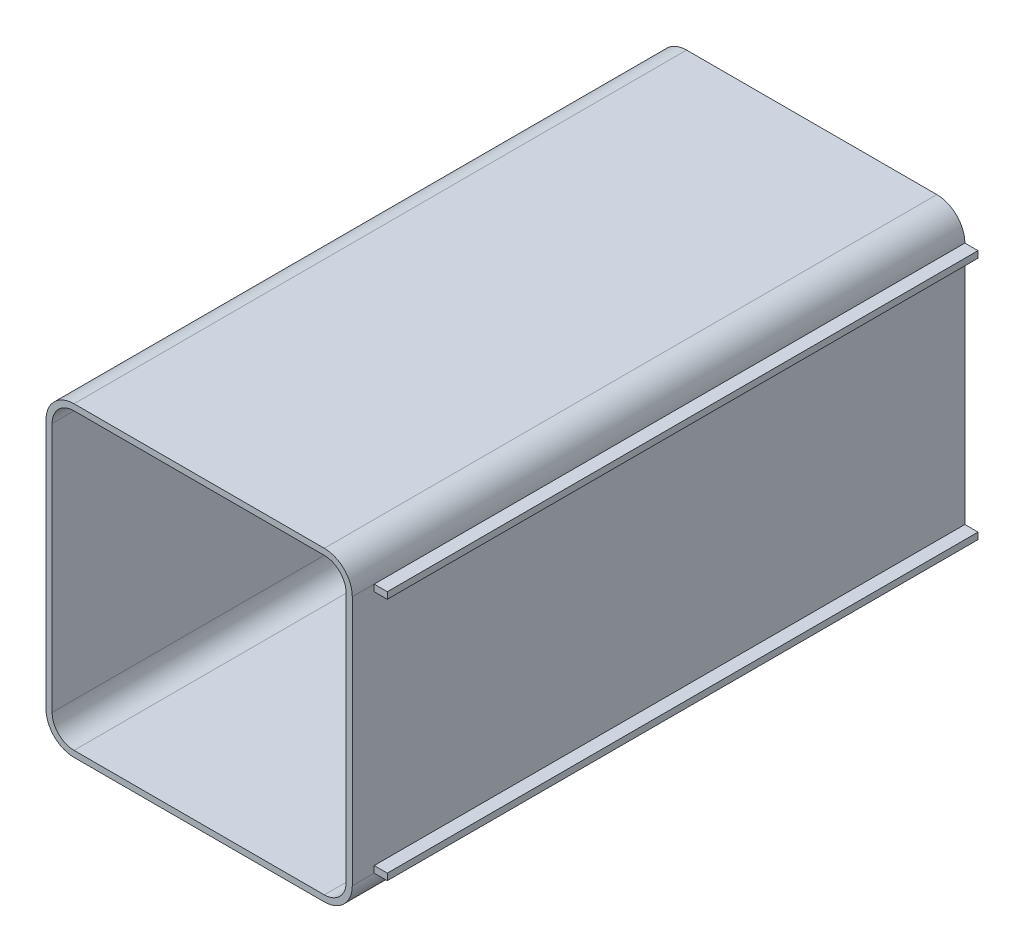
ISO-10303-21;
HEADER;
FILE_DESCRIPTION(('STEP AP214'),'2;1');
FILE_NAME('part.step','',(''),(''),'','','');
FILE_SCHEMA(('AUTOMOTIVE_DESIGN { 1 0 10303 214 1 1 1 1 }'));
ENDSEC;
DATA;
#1=APPLICATION_CONTEXT('core data for automotive mechanical design processes');
#2=APPLICATION_PROTOCOL_DEFINITION('international standard','automotive_design',2000,#1);
#3=PRODUCT_CONTEXT('',#1,'mechanical');
#4=PRODUCT('Part','Part','',(#3));
#5=PRODUCT_RELATED_PRODUCT_CATEGORY('part','',(#4));
#6=PRODUCT_DEFINITION_FORMATION('','',#4);
#7=PRODUCT_DEFINITION_CONTEXT('part definition',#1,'design');
#8=PRODUCT_DEFINITION('design','',#6,#7);
#9=PRODUCT_DEFINITION_SHAPE('','',#8);
#10=(LENGTH_UNIT() NAMED_UNIT(*) SI_UNIT(.MILLI.,.METRE.));
#11=(NAMED_UNIT(*) PLANE_ANGLE_UNIT() SI_UNIT($,.RADIAN.));
#12=(NAMED_UNIT(*) SI_UNIT($,.STERADIAN.) SOLID_ANGLE_UNIT());
#13=UNCERTAINTY_MEASURE_WITH_UNIT(LENGTH_MEASURE(1.E-05),#10,'distance_accuracy_value','');
#14=(GEOMETRIC_REPRESENTATION_CONTEXT(3) GLOBAL_UNCERTAINTY_ASSIGNED_CONTEXT((#13)) GLOBAL_UNIT_ASSIGNED_CONTEXT((#10,
#11,#12)) REPRESENTATION_CONTEXT('',''));
#15=CARTESIAN_POINT('',(0.,0.,0.));
#16=DIRECTION('',(0.,0.,1.));
#17=DIRECTION('',(1.,0.,0.));
#18=AXIS2_PLACEMENT_3D('',#15,#16,#17);
#19=CARTESIAN_POINT('',(70.,0.,140.));
#20=DIRECTION('',(-1.,0.,0.));
#21=DIRECTION('',(0.,0.,1.));
#22=AXIS2_PLACEMENT_3D('',#19,#20,#21);
#23=PLANE('',#22);
#24=DIRECTION('',(0.,-1.,0.));
#25=VECTOR('',#24,1.);
#26=CARTESIAN_POINT('',(70.,63.6,135.));
#27=LINE('',#26,#25);
#28=CARTESIAN_POINT('',(70.,63.6,135.));
#29=VERTEX_POINT('',#28);
#30=CARTESIAN_POINT('',(70.,62.1,135.));
#31=VERTEX_POINT('',#30);
#32=EDGE_CURVE('E403',#29,#31,#27,.T.);
#33=ORIENTED_EDGE('',*,*,#32,.F.);
#34=DIRECTION('',(0.,0.,-1.));
#35=VECTOR('',#34,1.);
#36=CARTESIAN_POINT('',(70.,63.6,140.));
#37=LINE('',#36,#35);
#38=CARTESIAN_POINT('',(70.,63.6,140.));
#39=VERTEX_POINT('',#38);
#40=EDGE_CURVE('E343',#29,#39,#37,.F.);
#41=ORIENTED_EDGE('',*,*,#40,.T.);
#42=DIRECTION('',(0.,1.,0.));
#43=VECTOR('',#42,1.);
#44=CARTESIAN_POINT('',(70.,0.,140.));
#45=LINE('',#44,#43);
#46=CARTESIAN_POINT('',(70.,6.4,140.));
#47=VERTEX_POINT('',#46);
#48=EDGE_CURVE('E278',#47,#39,#45,.T.);
#49=ORIENTED_EDGE('',*,*,#48,.F.);
#50=DIRECTION('',(0.,0.,-1.));
#51=VECTOR('',#50,1.);
#52=CARTESIAN_POINT('',(70.,6.4,140.));
#53=LINE('',#52,#51);
#54=CARTESIAN_POINT('',(70.,6.4,135.));
#55=VERTEX_POINT('',#54);
#56=EDGE_CURVE('E340',#47,#55,#53,.T.);
#57=ORIENTED_EDGE('',*,*,#56,.T.);
#58=DIRECTION('',(0.,-1.,0.));
#59=VECTOR('',#58,1.);
#60=CARTESIAN_POINT('',(70.,6.4,135.));
#61=LINE('',#60,#59);
#62=CARTESIAN_POINT('',(70.,7.9,135.));
#63=VERTEX_POINT('',#62);
#64=EDGE_CURVE('E211',#63,#55,#61,.T.);
#65=ORIENTED_EDGE('',*,*,#64,.F.);
#66=DIRECTION('',(0.,0.,1.));
#67=VECTOR('',#66,1.);
#68=CARTESIAN_POINT('',(70.,7.9,135.));
#69=LINE('',#68,#67);
#70=CARTESIAN_POINT('',(70.,7.9,0.));
#71=VERTEX_POINT('',#70);
#72=EDGE_CURVE('E224',#71,#63,#69,.T.);
#73=ORIENTED_EDGE('',*,*,#72,.F.);
#74=DIRECTION('',(0.,1.,0.));
#75=VECTOR('',#74,1.);
#76=CARTESIAN_POINT('',(70.,0.,0.));
#77=LINE('',#76,#75);
#78=CARTESIAN_POINT('',(70.,62.1,0.));
#79=VERTEX_POINT('',#78);
#80=EDGE_CURVE('E53',#71,#79,#77,.T.);
#81=ORIENTED_EDGE('',*,*,#80,.T.);
#82=DIRECTION('',(0.,0.,-1.));
#83=VECTOR('',#82,1.);
#84=CARTESIAN_POINT('',(70.,62.1,0.));
#85=LINE('',#84,#83);
#86=EDGE_CURVE('E48',#31,#79,#85,.T.);
#87=ORIENTED_EDGE('',*,*,#86,.F.);
#88=EDGE_LOOP('',(#33,#41,#49,#57,#65,#73,#81,#87));
#89=FACE_BOUND('',#88,.T.);
#90=ADVANCED_FACE('F33',(#89),#23,.F.);
#91=CARTESIAN_POINT('',(0.,0.,140.));
#92=DIRECTION('',(1.,0.,0.));
#93=DIRECTION('',(0.,0.,-1.));
#94=AXIS2_PLACEMENT_3D('',#91,#92,#93);
#95=PLANE('',#94);
#96=DIRECTION('',(0.,-1.,0.));
#97=VECTOR('',#96,1.);
#98=CARTESIAN_POINT('',(0.,0.,0.));
#99=LINE('',#98,#97);
#100=CARTESIAN_POINT('',(0.,63.6,0.));
#101=VERTEX_POINT('',#100);
#102=CARTESIAN_POINT('',(0.,6.4,0.));
#103=VERTEX_POINT('',#102);
#104=EDGE_CURVE('E260',#101,#103,#99,.T.);
#105=ORIENTED_EDGE('',*,*,#104,.T.);
#106=DIRECTION('',(0.,0.,-1.));
#107=VECTOR('',#106,1.);
#108=CARTESIAN_POINT('',(0.,6.4,140.));
#109=LINE('',#108,#107);
#110=CARTESIAN_POINT('',(0.,6.4,140.));
#111=VERTEX_POINT('',#110);
#112=EDGE_CURVE('E11',#103,#111,#109,.F.);
#113=ORIENTED_EDGE('',*,*,#112,.T.);
#114=DIRECTION('',(0.,-1.,0.));
#115=VECTOR('',#114,1.);
#116=CARTESIAN_POINT('',(0.,0.,140.));
#117=LINE('',#116,#115);
#118=CARTESIAN_POINT('',(0.,63.6,140.));
#119=VERTEX_POINT('',#118);
#120=EDGE_CURVE('E271',#119,#111,#117,.T.);
#121=ORIENTED_EDGE('',*,*,#120,.F.);
#122=DIRECTION('',(0.,0.,-1.));
#123=VECTOR('',#122,1.);
#124=CARTESIAN_POINT('',(0.,63.6,140.));
#125=LINE('',#124,#123);
#126=EDGE_CURVE('E41',#119,#101,#125,.T.);
#127=ORIENTED_EDGE('',*,*,#126,.T.);
#128=EDGE_LOOP('',(#105,#113,#121,#127));
#129=FACE_BOUND('',#128,.T.);
#130=ADVANCED_FACE('F363',(#129),#95,.F.);
#131=CARTESIAN_POINT('',(0.,0.,140.));
#132=DIRECTION('',(0.,1.,0.));
#133=DIRECTION('',(0.,0.,1.));
#134=AXIS2_PLACEMENT_3D('',#131,#132,#133);
#135=PLANE('',#134);
#136=DIRECTION('',(1.,0.,0.));
#137=VECTOR('',#136,1.);
#138=CARTESIAN_POINT('',(0.,0.,0.));
#139=LINE('',#138,#137);
#140=CARTESIAN_POINT('',(6.4,0.,0.));
#141=VERTEX_POINT('',#140);
#142=CARTESIAN_POINT('',(63.6,0.,0.));
#143=VERTEX_POINT('',#142);
#144=EDGE_CURVE('E287',#141,#143,#139,.T.);
#145=ORIENTED_EDGE('',*,*,#144,.T.);
#146=DIRECTION('',(0.,0.,-1.));
#147=VECTOR('',#146,1.);
#148=CARTESIAN_POINT('',(63.6,0.,140.));
#149=LINE('',#148,#147);
#150=CARTESIAN_POINT('',(63.6,0.,140.));
#151=VERTEX_POINT('',#150);
#152=EDGE_CURVE('E357',#143,#151,#149,.F.);
#153=ORIENTED_EDGE('',*,*,#152,.T.);
#154=DIRECTION('',(1.,0.,0.));
#155=VECTOR('',#154,1.);
#156=CARTESIAN_POINT('',(0.,0.,140.));
#157=LINE('',#156,#155);
#158=CARTESIAN_POINT('',(6.4,0.,140.));
#159=VERTEX_POINT('',#158);
#160=EDGE_CURVE('E274',#159,#151,#157,.T.);
#161=ORIENTED_EDGE('',*,*,#160,.F.);
#162=DIRECTION('',(0.,0.,-1.));
#163=VECTOR('',#162,1.);
#164=CARTESIAN_POINT('',(6.4,0.,140.));
#165=LINE('',#164,#163);
#166=EDGE_CURVE('E354',#159,#141,#165,.T.);
#167=ORIENTED_EDGE('',*,*,#166,.T.);
#168=EDGE_LOOP('',(#145,#153,#161,#167));
#169=FACE_BOUND('',#168,.T.);
#170=ADVANCED_FACE('F374',(#169),#135,.F.);
#171=CARTESIAN_POINT('',(0.,70.,140.));
#172=DIRECTION('',(0.,-1.,0.));
#173=DIRECTION('',(0.,0.,-1.));
#174=AXIS2_PLACEMENT_3D('',#171,#172,#173);
#175=PLANE('',#174);
#176=DIRECTION('',(-1.,0.,0.));
#177=VECTOR('',#176,1.);
#178=CARTESIAN_POINT('',(0.,70.,140.));
#179=LINE('',#178,#177);
#180=CARTESIAN_POINT('',(63.6,70.,140.));
#181=VERTEX_POINT('',#180);
#182=CARTESIAN_POINT('',(6.4,70.,140.));
#183=VERTEX_POINT('',#182);
#184=EDGE_CURVE('E281',#181,#183,#179,.T.);
#185=ORIENTED_EDGE('',*,*,#184,.F.);
#186=DIRECTION('',(0.,0.,-1.));
#187=VECTOR('',#186,1.);
#188=CARTESIAN_POINT('',(63.6,70.,140.));
#189=LINE('',#188,#187);
#190=CARTESIAN_POINT('',(63.6,70.,0.));
#191=VERTEX_POINT('',#190);
#192=EDGE_CURVE('E330',#181,#191,#189,.T.);
#193=ORIENTED_EDGE('',*,*,#192,.T.);
#194=DIRECTION('',(-1.,0.,0.));
#195=VECTOR('',#194,1.);
#196=CARTESIAN_POINT('',(0.,70.,0.));
#197=LINE('',#196,#195);
#198=CARTESIAN_POINT('',(6.4,70.,0.));
#199=VERTEX_POINT('',#198);
#200=EDGE_CURVE('E275',#191,#199,#197,.T.);
#201=ORIENTED_EDGE('',*,*,#200,.T.);
#202=DIRECTION('',(0.,0.,-1.));
#203=VECTOR('',#202,1.);
#204=CARTESIAN_POINT('',(6.4,70.,140.));
#205=LINE('',#204,#203);
#206=EDGE_CURVE('E328',#199,#183,#205,.F.);
#207=ORIENTED_EDGE('',*,*,#206,.T.);
#208=EDGE_LOOP('',(#185,#193,#201,#207));
#209=FACE_BOUND('',#208,.T.);
#210=ADVANCED_FACE('F425',(#209),#175,.F.);
#211=CARTESIAN_POINT('',(0.,0.,140.));
#212=DIRECTION('',(0.,0.,-1.));
#213=DIRECTION('',(-1.,0.,0.));
#214=AXIS2_PLACEMENT_3D('',#211,#212,#213);
#215=PLANE('',#214);
#216=DIRECTION('',(1.,0.,0.));
#217=VECTOR('',#216,1.);
#218=CARTESIAN_POINT('',(1.40000000000001,1.4,140.));
#219=LINE('',#218,#217);
#220=CARTESIAN_POINT('',(6.40000000000001,1.4,140.));
#221=VERTEX_POINT('',#220);
#222=CARTESIAN_POINT('',(63.6,1.4,140.));
#223=VERTEX_POINT('',#222);
#224=EDGE_CURVE('E263',#221,#223,#219,.T.);
#225=ORIENTED_EDGE('',*,*,#224,.F.);
#226=CARTESIAN_POINT('',(6.40000000000001,6.4,140.));
#227=DIRECTION('',(0.,0.,-1.));
#228=DIRECTION('',(-1.,0.,0.));
#229=AXIS2_PLACEMENT_3D('',#226,#227,#228);
#230=CIRCLE('',#229,5.);
#231=CARTESIAN_POINT('',(1.40000000000001,6.4,140.));
#232=VERTEX_POINT('',#231);
#233=EDGE_CURVE('E324',#221,#232,#230,.T.);
#234=ORIENTED_EDGE('',*,*,#233,.T.);
#235=DIRECTION('',(0.,-1.,0.));
#236=VECTOR('',#235,1.);
#237=CARTESIAN_POINT('',(1.4,68.6,140.));
#238=LINE('',#237,#236);
#239=CARTESIAN_POINT('',(1.4,63.6,140.));
#240=VERTEX_POINT('',#239);
#241=EDGE_CURVE('E246',#240,#232,#238,.T.);
#242=ORIENTED_EDGE('',*,*,#241,.F.);
#243=CARTESIAN_POINT('',(6.4,63.6,140.));
#244=DIRECTION('',(0.,0.,-1.));
#245=DIRECTION('',(-1.,0.,0.));
#246=AXIS2_PLACEMENT_3D('',#243,#244,#245);
#247=CIRCLE('',#246,5.);
#248=CARTESIAN_POINT('',(6.4,68.6,140.));
#249=VERTEX_POINT('',#248);
#250=EDGE_CURVE('E326',#240,#249,#247,.T.);
#251=ORIENTED_EDGE('',*,*,#250,.T.);
#252=DIRECTION('',(-1.,0.,0.));
#253=VECTOR('',#252,1.);
#254=CARTESIAN_POINT('',(1.4,68.6,140.));
#255=LINE('',#254,#253);
#256=CARTESIAN_POINT('',(63.6,68.6,140.));
#257=VERTEX_POINT('',#256);
#258=EDGE_CURVE('E251',#257,#249,#255,.T.);
#259=ORIENTED_EDGE('',*,*,#258,.F.);
#260=CARTESIAN_POINT('',(63.6,63.6,140.));
#261=DIRECTION('',(0.,0.,-1.));
#262=DIRECTION('',(-1.,0.,0.));
#263=AXIS2_PLACEMENT_3D('',#260,#261,#262);
#264=CIRCLE('',#263,5.);
#265=CARTESIAN_POINT('',(68.6,63.6,140.));
#266=VERTEX_POINT('',#265);
#267=EDGE_CURVE('E320',#257,#266,#264,.T.);
#268=ORIENTED_EDGE('',*,*,#267,.T.);
#269=DIRECTION('',(0.,1.,0.));
#270=VECTOR('',#269,1.);
#271=CARTESIAN_POINT('',(68.6,68.6,140.));
#272=LINE('',#271,#270);
#273=CARTESIAN_POINT('',(68.6,6.4,140.));
#274=VERTEX_POINT('',#273);
#275=EDGE_CURVE('E266',#274,#266,#272,.T.);
#276=ORIENTED_EDGE('',*,*,#275,.F.);
#277=CARTESIAN_POINT('',(63.6,6.4,140.));
#278=DIRECTION('',(0.,0.,-1.));
#279=DIRECTION('',(-1.,0.,0.));
#280=AXIS2_PLACEMENT_3D('',#277,#278,#279);
#281=CIRCLE('',#280,5.);
#282=EDGE_CURVE('E322',#274,#223,#281,.T.);
#283=ORIENTED_EDGE('',*,*,#282,.T.);
#284=EDGE_LOOP('',(#225,#234,#242,#251,#259,#268,#276,#283));
#285=FACE_BOUND('',#284,.T.);
#286=ORIENTED_EDGE('',*,*,#48,.T.);
#287=CARTESIAN_POINT('',(63.6,63.6,140.));
#288=DIRECTION('',(0.,0.,-1.));
#289=DIRECTION('',(-1.,0.,0.));
#290=AXIS2_PLACEMENT_3D('',#287,#288,#289);
#291=CIRCLE('',#290,6.4);
#292=EDGE_CURVE('E352',#39,#181,#291,.F.);
#293=ORIENTED_EDGE('',*,*,#292,.T.);
#294=ORIENTED_EDGE('',*,*,#184,.T.);
#295=CARTESIAN_POINT('',(6.4,63.6,140.));
#296=DIRECTION('',(0.,0.,-1.));
#297=DIRECTION('',(-1.,0.,0.));
#298=AXIS2_PLACEMENT_3D('',#295,#296,#297);
#299=CIRCLE('',#298,6.4);
#300=EDGE_CURVE('E346',#183,#119,#299,.F.);
#301=ORIENTED_EDGE('',*,*,#300,.T.);
#302=ORIENTED_EDGE('',*,*,#120,.T.);
#303=CARTESIAN_POINT('',(6.4,6.4,140.));
#304=DIRECTION('',(0.,0.,-1.));
#305=DIRECTION('',(-1.,0.,0.));
#306=AXIS2_PLACEMENT_3D('',#303,#304,#305);
#307=CIRCLE('',#306,6.4);
#308=EDGE_CURVE('E348',#111,#159,#307,.F.);
#309=ORIENTED_EDGE('',*,*,#308,.T.);
#310=ORIENTED_EDGE('',*,*,#160,.T.);
#311=CARTESIAN_POINT('',(63.6,6.4,140.));
#312=DIRECTION('',(0.,0.,-1.));
#313=DIRECTION('',(-1.,0.,0.));
#314=AXIS2_PLACEMENT_3D('',#311,#312,#313);
#315=CIRCLE('',#314,6.4);
#316=EDGE_CURVE('E350',#151,#47,#315,.F.);
#317=ORIENTED_EDGE('',*,*,#316,.T.);
#318=EDGE_LOOP('',(#286,#293,#294,#301,#302,#309,#310,#317));
#319=FACE_BOUND('',#318,.T.);
#320=ADVANCED_FACE('F378',(#285,#319),#215,.F.);
#321=CARTESIAN_POINT('',(0.,0.,0.));
#322=DIRECTION('',(0.,0.,-1.));
#323=DIRECTION('',(-1.,0.,0.));
#324=AXIS2_PLACEMENT_3D('',#321,#322,#323);
#325=PLANE('',#324);
#326=ORIENTED_EDGE('',*,*,#200,.F.);
#327=CARTESIAN_POINT('',(63.6,63.6,0.));
#328=DIRECTION('',(0.,0.,-1.));
#329=DIRECTION('',(-1.,0.,0.));
#330=AXIS2_PLACEMENT_3D('',#327,#328,#329);
#331=CIRCLE('',#330,6.4);
#332=CARTESIAN_POINT('',(70.,63.6,0.));
#333=VERTEX_POINT('',#332);
#334=EDGE_CURVE('E209',#191,#333,#331,.T.);
#335=ORIENTED_EDGE('',*,*,#334,.T.);
#336=DIRECTION('',(-1.,0.,0.));
#337=VECTOR('',#336,1.);
#338=CARTESIAN_POINT('',(73.,63.6,0.));
#339=LINE('',#338,#337);
#340=CARTESIAN_POINT('',(73.,63.6,0.));
#341=VERTEX_POINT('',#340);
#342=EDGE_CURVE('E191',#341,#333,#339,.T.);
#343=ORIENTED_EDGE('',*,*,#342,.F.);
#344=DIRECTION('',(0.,1.,0.));
#345=VECTOR('',#344,1.);
#346=CARTESIAN_POINT('',(73.,63.6,0.));
#347=LINE('',#346,#345);
#348=CARTESIAN_POINT('',(73.,62.1,0.));
#349=VERTEX_POINT('',#348);
#350=EDGE_CURVE('E197',#349,#341,#347,.T.);
#351=ORIENTED_EDGE('',*,*,#350,.F.);
#352=DIRECTION('',(-1.,0.,0.));
#353=VECTOR('',#352,1.);
#354=CARTESIAN_POINT('',(73.,62.1,0.));
#355=LINE('',#354,#353);
#356=EDGE_CURVE('E396',#349,#79,#355,.T.);
#357=ORIENTED_EDGE('',*,*,#356,.T.);
#358=ORIENTED_EDGE('',*,*,#80,.F.);
#359=DIRECTION('',(-1.,0.,0.));
#360=VECTOR('',#359,1.);
#361=CARTESIAN_POINT('',(73.,7.9,0.));
#362=LINE('',#361,#360);
#363=CARTESIAN_POINT('',(73.,7.9,0.));
#364=VERTEX_POINT('',#363);
#365=EDGE_CURVE('E237',#364,#71,#362,.T.);
#366=ORIENTED_EDGE('',*,*,#365,.F.);
#367=DIRECTION('',(0.,1.,0.));
#368=VECTOR('',#367,1.);
#369=CARTESIAN_POINT('',(73.,6.4,0.));
#370=LINE('',#369,#368);
#371=CARTESIAN_POINT('',(73.,6.4,0.));
#372=VERTEX_POINT('',#371);
#373=EDGE_CURVE('E226',#372,#364,#370,.T.);
#374=ORIENTED_EDGE('',*,*,#373,.F.);
#375=DIRECTION('',(-1.,0.,0.));
#376=VECTOR('',#375,1.);
#377=CARTESIAN_POINT('',(73.,6.4,0.));
#378=LINE('',#377,#376);
#379=CARTESIAN_POINT('',(70.,6.4,0.));
#380=VERTEX_POINT('',#379);
#381=EDGE_CURVE('E240',#372,#380,#378,.T.);
#382=ORIENTED_EDGE('',*,*,#381,.T.);
#383=CARTESIAN_POINT('',(63.6,6.4,0.));
#384=DIRECTION('',(0.,0.,-1.));
#385=DIRECTION('',(-1.,0.,0.));
#386=AXIS2_PLACEMENT_3D('',#383,#384,#385);
#387=CIRCLE('',#386,6.4);
#388=EDGE_CURVE('E337',#380,#143,#387,.T.);
#389=ORIENTED_EDGE('',*,*,#388,.T.);
#390=ORIENTED_EDGE('',*,*,#144,.F.);
#391=CARTESIAN_POINT('',(6.4,6.4,0.));
#392=DIRECTION('',(0.,0.,-1.));
#393=DIRECTION('',(-1.,0.,0.));
#394=AXIS2_PLACEMENT_3D('',#391,#392,#393);
#395=CIRCLE('',#394,6.4);
#396=EDGE_CURVE('E335',#141,#103,#395,.T.);
#397=ORIENTED_EDGE('',*,*,#396,.T.);
#398=ORIENTED_EDGE('',*,*,#104,.F.);
#399=CARTESIAN_POINT('',(6.4,63.6,0.));
#400=DIRECTION('',(0.,0.,-1.));
#401=DIRECTION('',(-1.,0.,0.));
#402=AXIS2_PLACEMENT_3D('',#399,#400,#401);
#403=CIRCLE('',#402,6.4);
#404=EDGE_CURVE('E333',#101,#199,#403,.T.);
#405=ORIENTED_EDGE('',*,*,#404,.T.);
#406=EDGE_LOOP('',(#326,#335,#343,#351,#357,#358,#366,#374,#382,#389,#390,#397,#398,#405));
#407=FACE_BOUND('',#406,.T.);
#408=ADVANCED_FACE('F208',(#407),#325,.T.);
#409=CARTESIAN_POINT('',(1.4,68.6,1.60000000000002));
#410=DIRECTION('',(-1.,0.,0.));
#411=DIRECTION('',(0.,-1.,0.));
#412=AXIS2_PLACEMENT_3D('',#409,#410,#411);
#413=PLANE('',#412);
#414=ORIENTED_EDGE('',*,*,#241,.T.);
#415=DIRECTION('',(0.,0.,1.));
#416=VECTOR('',#415,1.);
#417=CARTESIAN_POINT('',(1.40000000000001,6.4,1.60000000000002));
#418=LINE('',#417,#416);
#419=CARTESIAN_POINT('',(1.40000000000001,6.4,1.60000000000002));
#420=VERTEX_POINT('',#419);
#421=EDGE_CURVE('E318',#232,#420,#418,.F.);
#422=ORIENTED_EDGE('',*,*,#421,.T.);
#423=DIRECTION('',(0.,-1.,0.));
#424=VECTOR('',#423,1.);
#425=CARTESIAN_POINT('',(1.4,68.6,1.60000000000002));
#426=LINE('',#425,#424);
#427=CARTESIAN_POINT('',(1.4,63.6,1.60000000000002));
#428=VERTEX_POINT('',#427);
#429=EDGE_CURVE('E247',#428,#420,#426,.T.);
#430=ORIENTED_EDGE('',*,*,#429,.F.);
#431=DIRECTION('',(0.,0.,1.));
#432=VECTOR('',#431,1.);
#433=CARTESIAN_POINT('',(1.4,63.6,140.));
#434=LINE('',#433,#432);
#435=EDGE_CURVE('E315',#428,#240,#434,.T.);
#436=ORIENTED_EDGE('',*,*,#435,.T.);
#437=EDGE_LOOP('',(#414,#422,#430,#436));
#438=FACE_BOUND('',#437,.T.);
#439=ADVANCED_FACE('F473',(#438),#413,.F.);
#440=CARTESIAN_POINT('',(1.4,68.6,1.60000000000002));
#441=DIRECTION('',(0.,1.,0.));
#442=DIRECTION('',(0.,0.,1.));
#443=AXIS2_PLACEMENT_3D('',#440,#441,#442);
#444=PLANE('',#443);
#445=DIRECTION('',(-1.,0.,0.));
#446=VECTOR('',#445,1.);
#447=CARTESIAN_POINT('',(1.4,68.6,1.60000000000002));
#448=LINE('',#447,#446);
#449=CARTESIAN_POINT('',(63.6,68.6,1.60000000000002));
#450=VERTEX_POINT('',#449);
#451=CARTESIAN_POINT('',(6.4,68.6,1.60000000000002));
#452=VERTEX_POINT('',#451);
#453=EDGE_CURVE('E257',#450,#452,#448,.T.);
#454=ORIENTED_EDGE('',*,*,#453,.F.);
#455=DIRECTION('',(0.,0.,1.));
#456=VECTOR('',#455,1.);
#457=CARTESIAN_POINT('',(63.6,68.6,140.));
#458=LINE('',#457,#456);
#459=EDGE_CURVE('E294',#450,#257,#458,.T.);
#460=ORIENTED_EDGE('',*,*,#459,.T.);
#461=ORIENTED_EDGE('',*,*,#258,.T.);
#462=DIRECTION('',(0.,0.,1.));
#463=VECTOR('',#462,1.);
#464=CARTESIAN_POINT('',(6.4,68.6,1.60000000000002));
#465=LINE('',#464,#463);
#466=EDGE_CURVE('E284',#249,#452,#465,.F.);
#467=ORIENTED_EDGE('',*,*,#466,.T.);
#468=EDGE_LOOP('',(#454,#460,#461,#467));
#469=FACE_BOUND('',#468,.T.);
#470=ADVANCED_FACE('F478',(#469),#444,.F.);
#471=CARTESIAN_POINT('',(68.6,68.6,1.60000000000002));
#472=DIRECTION('',(1.,0.,0.));
#473=DIRECTION('',(0.,1.,0.));
#474=AXIS2_PLACEMENT_3D('',#471,#472,#473);
#475=PLANE('',#474);
#476=ORIENTED_EDGE('',*,*,#275,.T.);
#477=DIRECTION('',(0.,0.,1.));
#478=VECTOR('',#477,1.);
#479=CARTESIAN_POINT('',(68.6,63.6,1.60000000000002));
#480=LINE('',#479,#478);
#481=CARTESIAN_POINT('',(68.6,63.6,1.60000000000002));
#482=VERTEX_POINT('',#481);
#483=EDGE_CURVE('E300',#266,#482,#480,.F.);
#484=ORIENTED_EDGE('',*,*,#483,.T.);
#485=DIRECTION('',(0.,1.,0.));
#486=VECTOR('',#485,1.);
#487=CARTESIAN_POINT('',(68.6,68.6,1.60000000000002));
#488=LINE('',#487,#486);
#489=CARTESIAN_POINT('',(68.6,6.4,1.60000000000002));
#490=VERTEX_POINT('',#489);
#491=EDGE_CURVE('E254',#490,#482,#488,.T.);
#492=ORIENTED_EDGE('',*,*,#491,.F.);
#493=DIRECTION('',(0.,0.,1.));
#494=VECTOR('',#493,1.);
#495=CARTESIAN_POINT('',(68.6,6.4,140.));
#496=LINE('',#495,#494);
#497=EDGE_CURVE('E297',#490,#274,#496,.T.);
#498=ORIENTED_EDGE('',*,*,#497,.T.);
#499=EDGE_LOOP('',(#476,#484,#492,#498));
#500=FACE_BOUND('',#499,.T.);
#501=ADVANCED_FACE('F483',(#500),#475,.F.);
#502=CARTESIAN_POINT('',(1.40000000000001,1.4,1.60000000000002));
#503=DIRECTION('',(0.,-1.,0.));
#504=DIRECTION('',(0.,0.,-1.));
#505=AXIS2_PLACEMENT_3D('',#502,#503,#504);
#506=PLANE('',#505);
#507=ORIENTED_EDGE('',*,*,#224,.T.);
#508=DIRECTION('',(0.,0.,1.));
#509=VECTOR('',#508,1.);
#510=CARTESIAN_POINT('',(63.6,1.4,1.60000000000002));
#511=LINE('',#510,#509);
#512=CARTESIAN_POINT('',(63.6,1.4,1.60000000000002));
#513=VERTEX_POINT('',#512);
#514=EDGE_CURVE('E313',#223,#513,#511,.F.);
#515=ORIENTED_EDGE('',*,*,#514,.T.);
#516=DIRECTION('',(1.,0.,0.));
#517=VECTOR('',#516,1.);
#518=CARTESIAN_POINT('',(1.40000000000001,1.4,1.60000000000002));
#519=LINE('',#518,#517);
#520=CARTESIAN_POINT('',(6.40000000000001,1.4,1.60000000000002));
#521=VERTEX_POINT('',#520);
#522=EDGE_CURVE('E250',#521,#513,#519,.T.);
#523=ORIENTED_EDGE('',*,*,#522,.F.);
#524=DIRECTION('',(0.,0.,1.));
#525=VECTOR('',#524,1.);
#526=CARTESIAN_POINT('',(6.40000000000001,1.4,140.));
#527=LINE('',#526,#525);
#528=EDGE_CURVE('E310',#521,#221,#527,.T.);
#529=ORIENTED_EDGE('',*,*,#528,.T.);
#530=EDGE_LOOP('',(#507,#515,#523,#529));
#531=FACE_BOUND('',#530,.T.);
#532=ADVANCED_FACE('F480',(#531),#506,.F.);
#533=CARTESIAN_POINT('',(0.,0.,1.60000000000002));
#534=DIRECTION('',(0.,0.,1.));
#535=DIRECTION('',(1.,0.,0.));
#536=AXIS2_PLACEMENT_3D('',#533,#534,#535);
#537=PLANE('',#536);
#538=ORIENTED_EDGE('',*,*,#491,.T.);
#539=CARTESIAN_POINT('',(63.6,63.6,1.60000000000002));
#540=DIRECTION('',(0.,0.,1.));
#541=DIRECTION('',(1.,0.,0.));
#542=AXIS2_PLACEMENT_3D('',#539,#540,#541);
#543=CIRCLE('',#542,5.);
#544=EDGE_CURVE('E308',#482,#450,#543,.T.);
#545=ORIENTED_EDGE('',*,*,#544,.T.);
#546=ORIENTED_EDGE('',*,*,#453,.T.);
#547=CARTESIAN_POINT('',(6.4,63.6,1.60000000000002));
#548=DIRECTION('',(0.,0.,1.));
#549=DIRECTION('',(1.,0.,0.));
#550=AXIS2_PLACEMENT_3D('',#547,#548,#549);
#551=CIRCLE('',#550,5.);
#552=EDGE_CURVE('E302',#452,#428,#551,.T.);
#553=ORIENTED_EDGE('',*,*,#552,.T.);
#554=ORIENTED_EDGE('',*,*,#429,.T.);
#555=CARTESIAN_POINT('',(6.40000000000001,6.4,1.60000000000002));
#556=DIRECTION('',(0.,0.,1.));
#557=DIRECTION('',(1.,0.,0.));
#558=AXIS2_PLACEMENT_3D('',#555,#556,#557);
#559=CIRCLE('',#558,5.);
#560=EDGE_CURVE('E304',#420,#521,#559,.T.);
#561=ORIENTED_EDGE('',*,*,#560,.T.);
#562=ORIENTED_EDGE('',*,*,#522,.T.);
#563=CARTESIAN_POINT('',(63.6,6.4,1.60000000000002));
#564=DIRECTION('',(0.,0.,1.));
#565=DIRECTION('',(1.,0.,0.));
#566=AXIS2_PLACEMENT_3D('',#563,#564,#565);
#567=CIRCLE('',#566,5.);
#568=EDGE_CURVE('E306',#513,#490,#567,.T.);
#569=ORIENTED_EDGE('',*,*,#568,.T.);
#570=EDGE_LOOP('',(#538,#545,#546,#553,#554,#561,#562,#569));
#571=FACE_BOUND('',#570,.T.);
#572=ADVANCED_FACE('F433',(#571),#537,.T.);
#573=CARTESIAN_POINT('',(63.6,63.6,1.60000000000002));
#574=DIRECTION('',(0.,0.,-1.));
#575=DIRECTION('',(-1.,0.,0.));
#576=AXIS2_PLACEMENT_3D('',#573,#574,#575);
#577=CYLINDRICAL_SURFACE('',#576,5.);
#578=ORIENTED_EDGE('',*,*,#544,.F.);
#579=ORIENTED_EDGE('',*,*,#483,.F.);
#580=ORIENTED_EDGE('',*,*,#267,.F.);
#581=ORIENTED_EDGE('',*,*,#459,.F.);
#582=EDGE_LOOP('',(#578,#579,#580,#581));
#583=FACE_BOUND('',#582,.T.);
#584=ADVANCED_FACE('F429',(#583),#577,.F.);
#585=CARTESIAN_POINT('',(63.6,6.4,1.60000000000002));
#586=DIRECTION('',(0.,0.,-1.));
#587=DIRECTION('',(-1.,0.,0.));
#588=AXIS2_PLACEMENT_3D('',#585,#586,#587);
#589=CYLINDRICAL_SURFACE('',#588,5.);
#590=ORIENTED_EDGE('',*,*,#568,.F.);
#591=ORIENTED_EDGE('',*,*,#514,.F.);
#592=ORIENTED_EDGE('',*,*,#282,.F.);
#593=ORIENTED_EDGE('',*,*,#497,.F.);
#594=EDGE_LOOP('',(#590,#591,#592,#593));
#595=FACE_BOUND('',#594,.T.);
#596=ADVANCED_FACE('F432',(#595),#589,.F.);
#597=CARTESIAN_POINT('',(6.40000000000001,6.4,1.60000000000002));
#598=DIRECTION('',(0.,0.,-1.));
#599=DIRECTION('',(-1.,0.,0.));
#600=AXIS2_PLACEMENT_3D('',#597,#598,#599);
#601=CYLINDRICAL_SURFACE('',#600,5.);
#602=ORIENTED_EDGE('',*,*,#560,.F.);
#603=ORIENTED_EDGE('',*,*,#421,.F.);
#604=ORIENTED_EDGE('',*,*,#233,.F.);
#605=ORIENTED_EDGE('',*,*,#528,.F.);
#606=EDGE_LOOP('',(#602,#603,#604,#605));
#607=FACE_BOUND('',#606,.T.);
#608=ADVANCED_FACE('F437',(#607),#601,.F.);
#609=CARTESIAN_POINT('',(6.4,63.6,1.60000000000002));
#610=DIRECTION('',(0.,0.,-1.));
#611=DIRECTION('',(-1.,0.,0.));
#612=AXIS2_PLACEMENT_3D('',#609,#610,#611);
#613=CYLINDRICAL_SURFACE('',#612,5.);
#614=ORIENTED_EDGE('',*,*,#552,.F.);
#615=ORIENTED_EDGE('',*,*,#466,.F.);
#616=ORIENTED_EDGE('',*,*,#250,.F.);
#617=ORIENTED_EDGE('',*,*,#435,.F.);
#618=EDGE_LOOP('',(#614,#615,#616,#617));
#619=FACE_BOUND('',#618,.T.);
#620=ADVANCED_FACE('F441',(#619),#613,.F.);
#621=CARTESIAN_POINT('',(63.6,63.6,140.));
#622=DIRECTION('',(0.,0.,-1.));
#623=DIRECTION('',(-1.,0.,0.));
#624=AXIS2_PLACEMENT_3D('',#621,#622,#623);
#625=CYLINDRICAL_SURFACE('',#624,6.4);
#626=ORIENTED_EDGE('',*,*,#292,.F.);
#627=ORIENTED_EDGE('',*,*,#40,.F.);
#628=EDGE_CURVE('E344',#333,#29,#37,.F.);
#629=ORIENTED_EDGE('',*,*,#628,.F.);
#630=ORIENTED_EDGE('',*,*,#334,.F.);
#631=ORIENTED_EDGE('',*,*,#192,.F.);
#632=EDGE_LOOP('',(#626,#627,#629,#630,#631));
#633=FACE_BOUND('',#632,.T.);
#634=ADVANCED_FACE('F445',(#633),#625,.T.);
#635=CARTESIAN_POINT('',(63.6,6.4,140.));
#636=DIRECTION('',(0.,0.,-1.));
#637=DIRECTION('',(-1.,0.,0.));
#638=AXIS2_PLACEMENT_3D('',#635,#636,#637);
#639=CYLINDRICAL_SURFACE('',#638,6.4);
#640=ORIENTED_EDGE('',*,*,#316,.F.);
#641=ORIENTED_EDGE('',*,*,#152,.F.);
#642=ORIENTED_EDGE('',*,*,#388,.F.);
#643=DIRECTION('',(0.,0.,-1.));
#644=VECTOR('',#643,1.);
#645=CARTESIAN_POINT('',(70.,6.4,135.));
#646=LINE('',#645,#644);
#647=EDGE_CURVE('E214',#55,#380,#646,.T.);
#648=ORIENTED_EDGE('',*,*,#647,.F.);
#649=ORIENTED_EDGE('',*,*,#56,.F.);
#650=EDGE_LOOP('',(#640,#641,#642,#648,#649));
#651=FACE_BOUND('',#650,.T.);
#652=ADVANCED_FACE('F382',(#651),#639,.T.);
#653=CARTESIAN_POINT('',(6.4,6.4,140.));
#654=DIRECTION('',(0.,0.,-1.));
#655=DIRECTION('',(-1.,0.,0.));
#656=AXIS2_PLACEMENT_3D('',#653,#654,#655);
#657=CYLINDRICAL_SURFACE('',#656,6.4);
#658=ORIENTED_EDGE('',*,*,#308,.F.);
#659=ORIENTED_EDGE('',*,*,#112,.F.);
#660=ORIENTED_EDGE('',*,*,#396,.F.);
#661=ORIENTED_EDGE('',*,*,#166,.F.);
#662=EDGE_LOOP('',(#658,#659,#660,#661));
#663=FACE_BOUND('',#662,.T.);
#664=ADVANCED_FACE('F371',(#663),#657,.T.);
#665=CARTESIAN_POINT('',(6.4,63.6,140.));
#666=DIRECTION('',(0.,0.,-1.));
#667=DIRECTION('',(-1.,0.,0.));
#668=AXIS2_PLACEMENT_3D('',#665,#666,#667);
#669=CYLINDRICAL_SURFACE('',#668,6.4);
#670=ORIENTED_EDGE('',*,*,#300,.F.);
#671=ORIENTED_EDGE('',*,*,#206,.F.);
#672=ORIENTED_EDGE('',*,*,#404,.F.);
#673=ORIENTED_EDGE('',*,*,#126,.F.);
#674=EDGE_LOOP('',(#670,#671,#672,#673));
#675=FACE_BOUND('',#674,.T.);
#676=ADVANCED_FACE('F35',(#675),#669,.T.);
#677=CARTESIAN_POINT('',(73.,6.4,135.));
#678=DIRECTION('',(0.,0.,-1.));
#679=DIRECTION('',(-1.,0.,0.));
#680=AXIS2_PLACEMENT_3D('',#677,#678,#679);
#681=PLANE('',#680);
#682=ORIENTED_EDGE('',*,*,#64,.T.);
#683=DIRECTION('',(-1.,0.,0.));
#684=VECTOR('',#683,1.);
#685=CARTESIAN_POINT('',(73.,6.4,135.));
#686=LINE('',#685,#684);
#687=CARTESIAN_POINT('',(73.,6.4,135.));
#688=VERTEX_POINT('',#687);
#689=EDGE_CURVE('E243',#688,#55,#686,.T.);
#690=ORIENTED_EDGE('',*,*,#689,.F.);
#691=DIRECTION('',(0.,-1.,0.));
#692=VECTOR('',#691,1.);
#693=CARTESIAN_POINT('',(73.,6.4,135.));
#694=LINE('',#693,#692);
#695=CARTESIAN_POINT('',(73.,7.9,135.));
#696=VERTEX_POINT('',#695);
#697=EDGE_CURVE('E220',#696,#688,#694,.T.);
#698=ORIENTED_EDGE('',*,*,#697,.F.);
#699=DIRECTION('',(-1.,0.,0.));
#700=VECTOR('',#699,1.);
#701=CARTESIAN_POINT('',(73.,7.9,135.));
#702=LINE('',#701,#700);
#703=EDGE_CURVE('E229',#696,#63,#702,.T.);
#704=ORIENTED_EDGE('',*,*,#703,.T.);
#705=EDGE_LOOP('',(#682,#690,#698,#704));
#706=FACE_BOUND('',#705,.T.);
#707=ADVANCED_FACE('F389',(#706),#681,.F.);
#708=CARTESIAN_POINT('',(73.,6.4,135.));
#709=DIRECTION('',(0.,1.,0.));
#710=DIRECTION('',(0.,0.,1.));
#711=AXIS2_PLACEMENT_3D('',#708,#709,#710);
#712=PLANE('',#711);
#713=ORIENTED_EDGE('',*,*,#647,.T.);
#714=ORIENTED_EDGE('',*,*,#381,.F.);
#715=DIRECTION('',(0.,0.,-1.));
#716=VECTOR('',#715,1.);
#717=CARTESIAN_POINT('',(73.,6.4,135.));
#718=LINE('',#717,#716);
#719=EDGE_CURVE('E223',#688,#372,#718,.T.);
#720=ORIENTED_EDGE('',*,*,#719,.F.);
#721=ORIENTED_EDGE('',*,*,#689,.T.);
#722=EDGE_LOOP('',(#713,#714,#720,#721));
#723=FACE_BOUND('',#722,.T.);
#724=ADVANCED_FACE('F385',(#723),#712,.F.);
#725=CARTESIAN_POINT('',(73.,7.9,135.));
#726=DIRECTION('',(0.,-1.,0.));
#727=DIRECTION('',(0.,0.,-1.));
#728=AXIS2_PLACEMENT_3D('',#725,#726,#727);
#729=PLANE('',#728);
#730=ORIENTED_EDGE('',*,*,#72,.T.);
#731=ORIENTED_EDGE('',*,*,#703,.F.);
#732=DIRECTION('',(0.,0.,1.));
#733=VECTOR('',#732,1.);
#734=CARTESIAN_POINT('',(73.,7.9,135.));
#735=LINE('',#734,#733);
#736=EDGE_CURVE('E228',#364,#696,#735,.T.);
#737=ORIENTED_EDGE('',*,*,#736,.F.);
#738=ORIENTED_EDGE('',*,*,#365,.T.);
#739=EDGE_LOOP('',(#730,#731,#737,#738));
#740=FACE_BOUND('',#739,.T.);
#741=ADVANCED_FACE('F393',(#740),#729,.F.);
#742=CARTESIAN_POINT('',(73.,0.,0.));
#743=DIRECTION('',(-1.,0.,0.));
#744=DIRECTION('',(0.,0.,1.));
#745=AXIS2_PLACEMENT_3D('',#742,#743,#744);
#746=PLANE('',#745);
#747=ORIENTED_EDGE('',*,*,#697,.T.);
#748=ORIENTED_EDGE('',*,*,#719,.T.);
#749=ORIENTED_EDGE('',*,*,#373,.T.);
#750=ORIENTED_EDGE('',*,*,#736,.T.);
#751=EDGE_LOOP('',(#747,#748,#749,#750));
#752=FACE_BOUND('',#751,.T.);
#753=ADVANCED_FACE('F498',(#752),#746,.F.);
#754=CARTESIAN_POINT('',(73.,63.6,0.));
#755=DIRECTION('',(0.,-1.,0.));
#756=DIRECTION('',(0.,0.,-1.));
#757=AXIS2_PLACEMENT_3D('',#754,#755,#756);
#758=PLANE('',#757);
#759=ORIENTED_EDGE('',*,*,#628,.T.);
#760=DIRECTION('',(-1.,0.,0.));
#761=VECTOR('',#760,1.);
#762=CARTESIAN_POINT('',(73.,63.6,135.));
#763=LINE('',#762,#761);
#764=CARTESIAN_POINT('',(73.,63.6,135.));
#765=VERTEX_POINT('',#764);
#766=EDGE_CURVE('E193',#765,#29,#763,.T.);
#767=ORIENTED_EDGE('',*,*,#766,.F.);
#768=DIRECTION('',(0.,0.,1.));
#769=VECTOR('',#768,1.);
#770=CARTESIAN_POINT('',(73.,63.6,0.));
#771=LINE('',#770,#769);
#772=EDGE_CURVE('E186',#341,#765,#771,.T.);
#773=ORIENTED_EDGE('',*,*,#772,.F.);
#774=ORIENTED_EDGE('',*,*,#342,.T.);
#775=EDGE_LOOP('',(#759,#767,#773,#774));
#776=FACE_BOUND('',#775,.T.);
#777=ADVANCED_FACE('F189',(#776),#758,.F.);
#778=CARTESIAN_POINT('',(73.,63.6,135.));
#779=DIRECTION('',(0.,0.,-1.));
#780=DIRECTION('',(-1.,0.,0.));
#781=AXIS2_PLACEMENT_3D('',#778,#779,#780);
#782=PLANE('',#781);
#783=ORIENTED_EDGE('',*,*,#32,.T.);
#784=DIRECTION('',(-1.,0.,0.));
#785=VECTOR('',#784,1.);
#786=CARTESIAN_POINT('',(73.,62.1,135.));
#787=LINE('',#786,#785);
#788=CARTESIAN_POINT('',(73.,62.1,135.));
#789=VERTEX_POINT('',#788);
#790=EDGE_CURVE('E216',#789,#31,#787,.T.);
#791=ORIENTED_EDGE('',*,*,#790,.F.);
#792=DIRECTION('',(0.,-1.,0.));
#793=VECTOR('',#792,1.);
#794=CARTESIAN_POINT('',(73.,63.6,135.));
#795=LINE('',#794,#793);
#796=EDGE_CURVE('E196',#765,#789,#795,.T.);
#797=ORIENTED_EDGE('',*,*,#796,.F.);
#798=ORIENTED_EDGE('',*,*,#766,.T.);
#799=EDGE_LOOP('',(#783,#791,#797,#798));
#800=FACE_BOUND('',#799,.T.);
#801=ADVANCED_FACE('F407',(#800),#782,.F.);
#802=CARTESIAN_POINT('',(73.,62.1,0.));
#803=DIRECTION('',(0.,1.,0.));
#804=DIRECTION('',(0.,0.,1.));
#805=AXIS2_PLACEMENT_3D('',#802,#803,#804);
#806=PLANE('',#805);
#807=ORIENTED_EDGE('',*,*,#86,.T.);
#808=ORIENTED_EDGE('',*,*,#356,.F.);
#809=DIRECTION('',(0.,0.,-1.));
#810=VECTOR('',#809,1.);
#811=CARTESIAN_POINT('',(73.,62.1,0.));
#812=LINE('',#811,#810);
#813=EDGE_CURVE('E202',#789,#349,#812,.T.);
#814=ORIENTED_EDGE('',*,*,#813,.F.);
#815=ORIENTED_EDGE('',*,*,#790,.T.);
#816=EDGE_LOOP('',(#807,#808,#814,#815));
#817=FACE_BOUND('',#816,.T.);
#818=ADVANCED_FACE('F408',(#817),#806,.F.);
#819=CARTESIAN_POINT('',(73.,0.,0.));
#820=DIRECTION('',(-1.,0.,0.));
#821=DIRECTION('',(0.,0.,1.));
#822=AXIS2_PLACEMENT_3D('',#819,#820,#821);
#823=PLANE('',#822);
#824=ORIENTED_EDGE('',*,*,#350,.T.);
#825=ORIENTED_EDGE('',*,*,#772,.T.);
#826=ORIENTED_EDGE('',*,*,#796,.T.);
#827=ORIENTED_EDGE('',*,*,#813,.T.);
#828=EDGE_LOOP('',(#824,#825,#826,#827));
#829=FACE_BOUND('',#828,.T.);
#830=ADVANCED_FACE('F200',(#829),#823,.F.);
#831=CLOSED_SHELL('',(#90,#130,#170,#210,#320,#408,#439,#470,#501,#532,#572,#584,#596,#608,#620,
#634,#652,#664,#676,#707,#724,#741,#753,#777,#801,#818,#830));
#832=MANIFOLD_SOLID_BREP('B2',#831);
#833=ADVANCED_BREP_SHAPE_REPRESENTATION('',(#18,#832),#14);
#834=SHAPE_DEFINITION_REPRESENTATION(#9,#833);
ENDSEC;
END-ISO-10303-21;
